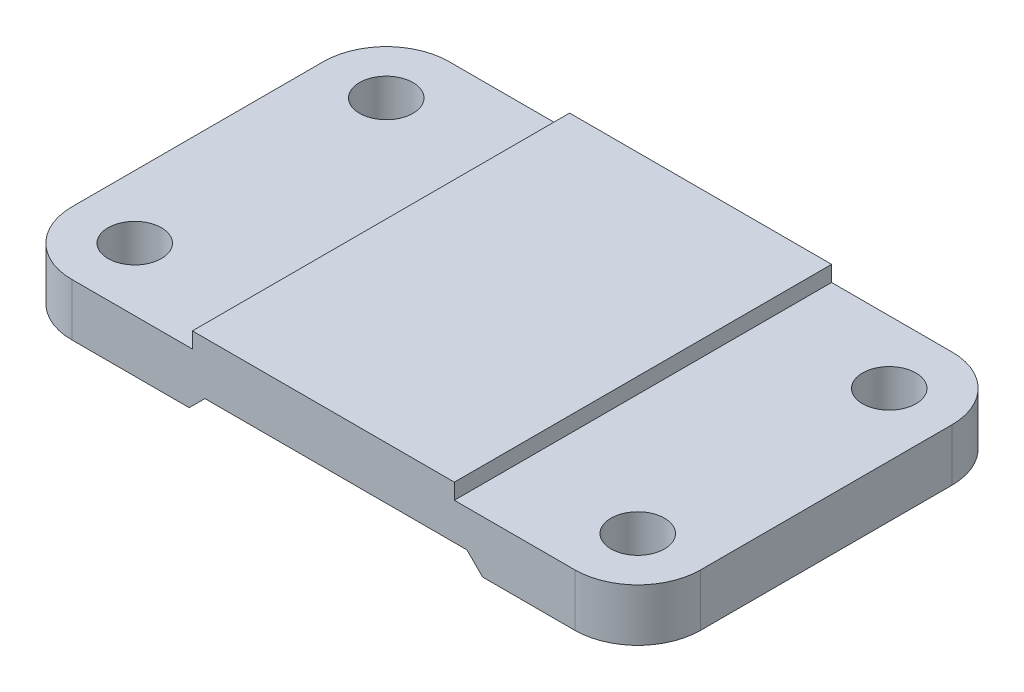
ISO-10303-21;
HEADER;
FILE_DESCRIPTION(('STEP AP214'),'2;1');
FILE_NAME('part.step','',(''),(''),'','','');
FILE_SCHEMA(('AUTOMOTIVE_DESIGN { 1 0 10303 214 1 1 1 1 }'));
ENDSEC;
DATA;
#1=APPLICATION_CONTEXT('core data for automotive mechanical design processes');
#2=APPLICATION_PROTOCOL_DEFINITION('international standard','automotive_design',2000,#1);
#3=PRODUCT_CONTEXT('',#1,'mechanical');
#4=PRODUCT('Part','Part','',(#3));
#5=PRODUCT_RELATED_PRODUCT_CATEGORY('part','',(#4));
#6=PRODUCT_DEFINITION_FORMATION('','',#4);
#7=PRODUCT_DEFINITION_CONTEXT('part definition',#1,'design');
#8=PRODUCT_DEFINITION('design','',#6,#7);
#9=PRODUCT_DEFINITION_SHAPE('','',#8);
#10=(LENGTH_UNIT() NAMED_UNIT(*) SI_UNIT(.MILLI.,.METRE.));
#11=(NAMED_UNIT(*) PLANE_ANGLE_UNIT() SI_UNIT($,.RADIAN.));
#12=(NAMED_UNIT(*) SI_UNIT($,.STERADIAN.) SOLID_ANGLE_UNIT());
#13=UNCERTAINTY_MEASURE_WITH_UNIT(LENGTH_MEASURE(1.E-05),#10,'distance_accuracy_value','');
#14=(GEOMETRIC_REPRESENTATION_CONTEXT(3) GLOBAL_UNCERTAINTY_ASSIGNED_CONTEXT((#13)) GLOBAL_UNIT_ASSIGNED_CONTEXT((#10,
#11,#12)) REPRESENTATION_CONTEXT('',''));
#15=CARTESIAN_POINT('',(0.,0.,0.));
#16=DIRECTION('',(0.,0.,1.));
#17=DIRECTION('',(1.,0.,0.));
#18=AXIS2_PLACEMENT_3D('',#15,#16,#17);
#19=CARTESIAN_POINT('',(-48.,0.,24.));
#20=DIRECTION('',(0.,-1.,0.));
#21=DIRECTION('',(0.,0.,-1.));
#22=AXIS2_PLACEMENT_3D('',#19,#20,#21);
#23=PLANE('',#22);
#24=DIRECTION('',(0.,0.,1.));
#25=VECTOR('',#24,1.);
#26=CARTESIAN_POINT('',(-25.6042673778964,0.,-36.));
#27=LINE('',#26,#25);
#28=CARTESIAN_POINT('',(-25.6042673778964,0.,-36.));
#29=VERTEX_POINT('',#28);
#30=CARTESIAN_POINT('',(-25.6042673778964,0.,36.));
#31=VERTEX_POINT('',#30);
#32=EDGE_CURVE('E287',#29,#31,#27,.T.);
#33=ORIENTED_EDGE('',*,*,#32,.T.);
#34=DIRECTION('',(1.,0.,0.));
#35=VECTOR('',#34,1.);
#36=CARTESIAN_POINT('',(47.9999999999999,0.,36.));
#37=LINE('',#36,#35);
#38=CARTESIAN_POINT('',(-47.9999999999999,0.,36.));
#39=VERTEX_POINT('',#38);
#40=EDGE_CURVE('E221',#39,#31,#37,.T.);
#41=ORIENTED_EDGE('',*,*,#40,.F.);
#42=CARTESIAN_POINT('',(-48.,0.,24.));
#43=DIRECTION('',(0.,1.,0.));
#44=DIRECTION('',(0.,0.,-1.));
#45=AXIS2_PLACEMENT_3D('',#42,#43,#44);
#46=CIRCLE('',#45,12.);
#47=CARTESIAN_POINT('',(-60.,0.,23.9999999999999));
#48=VERTEX_POINT('',#47);
#49=EDGE_CURVE('E226',#48,#39,#46,.T.);
#50=ORIENTED_EDGE('',*,*,#49,.F.);
#51=DIRECTION('',(0.,0.,1.));
#52=VECTOR('',#51,1.);
#53=CARTESIAN_POINT('',(-60.,0.,-23.9999999999999));
#54=LINE('',#53,#52);
#55=CARTESIAN_POINT('',(-60.,0.,-23.9999999999999));
#56=VERTEX_POINT('',#55);
#57=EDGE_CURVE('E185',#56,#48,#54,.T.);
#58=ORIENTED_EDGE('',*,*,#57,.F.);
#59=CARTESIAN_POINT('',(-48.,0.,-24.));
#60=DIRECTION('',(0.,1.,0.));
#61=DIRECTION('',(0.,0.,1.));
#62=AXIS2_PLACEMENT_3D('',#59,#60,#61);
#63=CIRCLE('',#62,12.);
#64=CARTESIAN_POINT('',(-47.9999999999999,0.,-36.));
#65=VERTEX_POINT('',#64);
#66=EDGE_CURVE('E182',#65,#56,#63,.T.);
#67=ORIENTED_EDGE('',*,*,#66,.F.);
#68=DIRECTION('',(-1.,0.,0.));
#69=VECTOR('',#68,1.);
#70=CARTESIAN_POINT('',(47.9999999999999,0.,-36.));
#71=LINE('',#70,#69);
#72=EDGE_CURVE('E183',#29,#65,#71,.T.);
#73=ORIENTED_EDGE('',*,*,#72,.F.);
#74=EDGE_LOOP('',(#33,#41,#50,#58,#67,#73));
#75=FACE_BOUND('',#74,.T.);
#76=CARTESIAN_POINT('',(-48.,0.,24.));
#77=DIRECTION('',(0.,1.,0.));
#78=DIRECTION('',(0.,0.,-1.));
#79=AXIS2_PLACEMENT_3D('',#76,#77,#78);
#80=CIRCLE('',#79,5.09999999999998);
#81=CARTESIAN_POINT('',(-48.,0.,18.9));
#82=VERTEX_POINT('',#81);
#83=EDGE_CURVE('E252',#82,#82,#80,.T.);
#84=ORIENTED_EDGE('',*,*,#83,.T.);
#85=EDGE_LOOP('',(#84));
#86=FACE_BOUND('',#85,.T.);
#87=CARTESIAN_POINT('',(-48.,0.,-24.));
#88=DIRECTION('',(0.,1.,0.));
#89=DIRECTION('',(0.,0.,1.));
#90=AXIS2_PLACEMENT_3D('',#87,#88,#89);
#91=CIRCLE('',#90,5.1);
#92=CARTESIAN_POINT('',(-48.,0.,-18.9));
#93=VERTEX_POINT('',#92);
#94=EDGE_CURVE('E246',#93,#93,#91,.T.);
#95=ORIENTED_EDGE('',*,*,#94,.T.);
#96=EDGE_LOOP('',(#95));
#97=FACE_BOUND('',#96,.T.);
#98=ADVANCED_FACE('F43',(#75,#86,#97),#23,.T.);
#99=CARTESIAN_POINT('',(-48.,10.,24.));
#100=DIRECTION('',(0.,-1.,0.));
#101=DIRECTION('',(0.,0.,-1.));
#102=AXIS2_PLACEMENT_3D('',#99,#100,#101);
#103=PLANE('',#102);
#104=CARTESIAN_POINT('',(-48.,10.,24.));
#105=DIRECTION('',(0.,1.,0.));
#106=DIRECTION('',(0.,0.,-1.));
#107=AXIS2_PLACEMENT_3D('',#104,#105,#106);
#108=CIRCLE('',#107,5.09999999999998);
#109=CARTESIAN_POINT('',(-48.,10.,18.9));
#110=VERTEX_POINT('',#109);
#111=EDGE_CURVE('E249',#110,#110,#108,.T.);
#112=ORIENTED_EDGE('',*,*,#111,.F.);
#113=EDGE_LOOP('',(#112));
#114=FACE_BOUND('',#113,.T.);
#115=CARTESIAN_POINT('',(-48.,10.,-24.));
#116=DIRECTION('',(0.,1.,0.));
#117=DIRECTION('',(0.,0.,1.));
#118=AXIS2_PLACEMENT_3D('',#115,#116,#117);
#119=CIRCLE('',#118,5.1);
#120=CARTESIAN_POINT('',(-48.,10.,-18.9));
#121=VERTEX_POINT('',#120);
#122=EDGE_CURVE('E229',#121,#121,#119,.T.);
#123=ORIENTED_EDGE('',*,*,#122,.F.);
#124=EDGE_LOOP('',(#123));
#125=FACE_BOUND('',#124,.T.);
#126=DIRECTION('',(0.,0.,1.));
#127=VECTOR('',#126,1.);
#128=CARTESIAN_POINT('',(-25.,10.,36.));
#129=LINE('',#128,#127);
#130=CARTESIAN_POINT('',(-25.,10.,-36.));
#131=VERTEX_POINT('',#130);
#132=CARTESIAN_POINT('',(-25.,10.,36.));
#133=VERTEX_POINT('',#132);
#134=EDGE_CURVE('E66',#131,#133,#129,.T.);
#135=ORIENTED_EDGE('',*,*,#134,.F.);
#136=DIRECTION('',(-1.,0.,0.));
#137=VECTOR('',#136,1.);
#138=CARTESIAN_POINT('',(47.9999999999999,10.,-36.));
#139=LINE('',#138,#137);
#140=CARTESIAN_POINT('',(-47.9999999999999,10.,-36.));
#141=VERTEX_POINT('',#140);
#142=EDGE_CURVE('E235',#131,#141,#139,.T.);
#143=ORIENTED_EDGE('',*,*,#142,.T.);
#144=CARTESIAN_POINT('',(-48.,10.,-24.));
#145=DIRECTION('',(0.,1.,0.));
#146=DIRECTION('',(0.,0.,1.));
#147=AXIS2_PLACEMENT_3D('',#144,#145,#146);
#148=CIRCLE('',#147,12.);
#149=CARTESIAN_POINT('',(-60.,10.,-23.9999999999999));
#150=VERTEX_POINT('',#149);
#151=EDGE_CURVE('E231',#141,#150,#148,.T.);
#152=ORIENTED_EDGE('',*,*,#151,.T.);
#153=DIRECTION('',(0.,0.,1.));
#154=VECTOR('',#153,1.);
#155=CARTESIAN_POINT('',(-60.,10.,-23.9999999999999));
#156=LINE('',#155,#154);
#157=CARTESIAN_POINT('',(-60.,10.,23.9999999999999));
#158=VERTEX_POINT('',#157);
#159=EDGE_CURVE('E197',#150,#158,#156,.T.);
#160=ORIENTED_EDGE('',*,*,#159,.T.);
#161=CARTESIAN_POINT('',(-48.,10.,24.));
#162=DIRECTION('',(0.,1.,0.));
#163=DIRECTION('',(0.,0.,-1.));
#164=AXIS2_PLACEMENT_3D('',#161,#162,#163);
#165=CIRCLE('',#164,12.);
#166=CARTESIAN_POINT('',(-47.9999999999999,10.,36.));
#167=VERTEX_POINT('',#166);
#168=EDGE_CURVE('E192',#158,#167,#165,.T.);
#169=ORIENTED_EDGE('',*,*,#168,.T.);
#170=DIRECTION('',(1.,0.,0.));
#171=VECTOR('',#170,1.);
#172=CARTESIAN_POINT('',(47.9999999999999,10.,36.));
#173=LINE('',#172,#171);
#174=EDGE_CURVE('E241',#167,#133,#173,.T.);
#175=ORIENTED_EDGE('',*,*,#174,.T.);
#176=EDGE_LOOP('',(#135,#143,#152,#160,#169,#175));
#177=FACE_BOUND('',#176,.T.);
#178=ADVANCED_FACE('F326',(#114,#125,#177),#103,.F.);
#179=CARTESIAN_POINT('',(48.,10.,-24.));
#180=DIRECTION('',(0.,1.,0.));
#181=DIRECTION('',(0.,0.,-1.));
#182=AXIS2_PLACEMENT_3D('',#179,#180,#181);
#183=CIRCLE('',#182,5.1);
#184=CARTESIAN_POINT('',(48.,10.,-29.1));
#185=VERTEX_POINT('',#184);
#186=EDGE_CURVE('E261',#185,#185,#183,.T.);
#187=ORIENTED_EDGE('',*,*,#186,.F.);
#188=EDGE_LOOP('',(#187));
#189=FACE_BOUND('',#188,.T.);
#190=CARTESIAN_POINT('',(48.,10.,24.));
#191=DIRECTION('',(0.,1.,0.));
#192=DIRECTION('',(0.,0.,1.));
#193=AXIS2_PLACEMENT_3D('',#190,#191,#192);
#194=CIRCLE('',#193,5.09999999999998);
#195=CARTESIAN_POINT('',(48.,10.,29.1));
#196=VERTEX_POINT('',#195);
#197=EDGE_CURVE('E255',#196,#196,#194,.T.);
#198=ORIENTED_EDGE('',*,*,#197,.F.);
#199=EDGE_LOOP('',(#198));
#200=FACE_BOUND('',#199,.T.);
#201=DIRECTION('',(0.,0.,-1.));
#202=VECTOR('',#201,1.);
#203=CARTESIAN_POINT('',(25.,10.,36.));
#204=LINE('',#203,#202);
#205=CARTESIAN_POINT('',(25.,10.,36.));
#206=VERTEX_POINT('',#205);
#207=CARTESIAN_POINT('',(25.,10.,-36.));
#208=VERTEX_POINT('',#207);
#209=EDGE_CURVE('E282',#206,#208,#204,.T.);
#210=ORIENTED_EDGE('',*,*,#209,.F.);
#211=CARTESIAN_POINT('',(47.9999999999999,10.,36.));
#212=VERTEX_POINT('',#211);
#213=EDGE_CURVE('E243',#206,#212,#173,.T.);
#214=ORIENTED_EDGE('',*,*,#213,.T.);
#215=CARTESIAN_POINT('',(48.,10.,24.));
#216=DIRECTION('',(0.,1.,0.));
#217=DIRECTION('',(0.,0.,-1.));
#218=AXIS2_PLACEMENT_3D('',#215,#216,#217);
#219=CIRCLE('',#218,12.);
#220=CARTESIAN_POINT('',(60.,10.,23.9999999999999));
#221=VERTEX_POINT('',#220);
#222=EDGE_CURVE('E216',#212,#221,#219,.T.);
#223=ORIENTED_EDGE('',*,*,#222,.T.);
#224=DIRECTION('',(0.,0.,-1.));
#225=VECTOR('',#224,1.);
#226=CARTESIAN_POINT('',(60.,10.,-23.9999999999999));
#227=LINE('',#226,#225);
#228=CARTESIAN_POINT('',(60.,10.,-23.9999999999999));
#229=VERTEX_POINT('',#228);
#230=EDGE_CURVE('E238',#221,#229,#227,.T.);
#231=ORIENTED_EDGE('',*,*,#230,.T.);
#232=CARTESIAN_POINT('',(48.,10.,-24.));
#233=DIRECTION('',(0.,1.,0.));
#234=DIRECTION('',(0.,0.,-1.));
#235=AXIS2_PLACEMENT_3D('',#232,#233,#234);
#236=CIRCLE('',#235,12.);
#237=CARTESIAN_POINT('',(47.9999999999999,10.,-36.));
#238=VERTEX_POINT('',#237);
#239=EDGE_CURVE('E236',#229,#238,#236,.T.);
#240=ORIENTED_EDGE('',*,*,#239,.T.);
#241=EDGE_CURVE('E233',#238,#208,#139,.T.);
#242=ORIENTED_EDGE('',*,*,#241,.T.);
#243=EDGE_LOOP('',(#210,#214,#223,#231,#240,#242));
#244=FACE_BOUND('',#243,.T.);
#245=ADVANCED_FACE('F342',(#189,#200,#244),#103,.F.);
#246=DIRECTION('',(0.,0.,1.));
#247=VECTOR('',#246,1.);
#248=CARTESIAN_POINT('',(30.3957326221036,0.,-36.));
#249=LINE('',#248,#247);
#250=CARTESIAN_POINT('',(30.3957326221036,0.,-36.));
#251=VERTEX_POINT('',#250);
#252=CARTESIAN_POINT('',(30.3957326221036,0.,36.));
#253=VERTEX_POINT('',#252);
#254=EDGE_CURVE('E159',#251,#253,#249,.T.);
#255=ORIENTED_EDGE('',*,*,#254,.F.);
#256=CARTESIAN_POINT('',(47.9999999999999,0.,-36.));
#257=VERTEX_POINT('',#256);
#258=EDGE_CURVE('E172',#257,#251,#71,.T.);
#259=ORIENTED_EDGE('',*,*,#258,.F.);
#260=CARTESIAN_POINT('',(48.,0.,-24.));
#261=DIRECTION('',(0.,1.,0.));
#262=DIRECTION('',(0.,0.,-1.));
#263=AXIS2_PLACEMENT_3D('',#260,#261,#262);
#264=CIRCLE('',#263,12.);
#265=CARTESIAN_POINT('',(60.,0.,-23.9999999999999));
#266=VERTEX_POINT('',#265);
#267=EDGE_CURVE('E187',#266,#257,#264,.T.);
#268=ORIENTED_EDGE('',*,*,#267,.F.);
#269=DIRECTION('',(0.,0.,-1.));
#270=VECTOR('',#269,1.);
#271=CARTESIAN_POINT('',(60.,0.,-23.9999999999999));
#272=LINE('',#271,#270);
#273=CARTESIAN_POINT('',(60.,0.,23.9999999999999));
#274=VERTEX_POINT('',#273);
#275=EDGE_CURVE('E220',#274,#266,#272,.T.);
#276=ORIENTED_EDGE('',*,*,#275,.F.);
#277=CARTESIAN_POINT('',(48.,0.,24.));
#278=DIRECTION('',(0.,1.,0.));
#279=DIRECTION('',(0.,0.,-1.));
#280=AXIS2_PLACEMENT_3D('',#277,#278,#279);
#281=CIRCLE('',#280,12.);
#282=CARTESIAN_POINT('',(47.9999999999999,0.,36.));
#283=VERTEX_POINT('',#282);
#284=EDGE_CURVE('E215',#283,#274,#281,.T.);
#285=ORIENTED_EDGE('',*,*,#284,.F.);
#286=EDGE_CURVE('E174',#253,#283,#37,.T.);
#287=ORIENTED_EDGE('',*,*,#286,.F.);
#288=EDGE_LOOP('',(#255,#259,#268,#276,#285,#287));
#289=FACE_BOUND('',#288,.T.);
#290=CARTESIAN_POINT('',(48.,0.,24.));
#291=DIRECTION('',(0.,1.,0.));
#292=DIRECTION('',(0.,0.,1.));
#293=AXIS2_PLACEMENT_3D('',#290,#291,#292);
#294=CIRCLE('',#293,5.09999999999998);
#295=CARTESIAN_POINT('',(48.,0.,29.1));
#296=VERTEX_POINT('',#295);
#297=EDGE_CURVE('E258',#296,#296,#294,.T.);
#298=ORIENTED_EDGE('',*,*,#297,.T.);
#299=EDGE_LOOP('',(#298));
#300=FACE_BOUND('',#299,.T.);
#301=CARTESIAN_POINT('',(48.,0.,-24.));
#302=DIRECTION('',(0.,1.,0.));
#303=DIRECTION('',(0.,0.,-1.));
#304=AXIS2_PLACEMENT_3D('',#301,#302,#303);
#305=CIRCLE('',#304,5.1);
#306=CARTESIAN_POINT('',(48.,0.,-29.1));
#307=VERTEX_POINT('',#306);
#308=EDGE_CURVE('E264',#307,#307,#305,.T.);
#309=ORIENTED_EDGE('',*,*,#308,.T.);
#310=EDGE_LOOP('',(#309));
#311=FACE_BOUND('',#310,.T.);
#312=ADVANCED_FACE('F169',(#289,#300,#311),#23,.T.);
#313=CARTESIAN_POINT('',(-48.,10.,24.));
#314=DIRECTION('',(0.,-1.,0.));
#315=DIRECTION('',(0.,0.,-1.));
#316=AXIS2_PLACEMENT_3D('',#313,#314,#315);
#317=CYLINDRICAL_SURFACE('',#316,12.);
#318=ORIENTED_EDGE('',*,*,#49,.T.);
#319=DIRECTION('',(0.,-1.,0.));
#320=VECTOR('',#319,1.);
#321=CARTESIAN_POINT('',(-47.9999999999999,10.,36.));
#322=LINE('',#321,#320);
#323=EDGE_CURVE('E11',#167,#39,#322,.T.);
#324=ORIENTED_EDGE('',*,*,#323,.F.);
#325=ORIENTED_EDGE('',*,*,#168,.F.);
#326=DIRECTION('',(0.,-1.,0.));
#327=VECTOR('',#326,1.);
#328=CARTESIAN_POINT('',(-60.,10.,23.9999999999999));
#329=LINE('',#328,#327);
#330=EDGE_CURVE('E193',#158,#48,#329,.T.);
#331=ORIENTED_EDGE('',*,*,#330,.T.);
#332=EDGE_LOOP('',(#318,#324,#325,#331));
#333=FACE_BOUND('',#332,.T.);
#334=ADVANCED_FACE('F45',(#333),#317,.T.);
#335=CARTESIAN_POINT('',(47.9999999999999,10.,36.));
#336=DIRECTION('',(0.,0.,-1.));
#337=DIRECTION('',(-1.,0.,0.));
#338=AXIS2_PLACEMENT_3D('',#335,#336,#337);
#339=PLANE('',#338);
#340=ORIENTED_EDGE('',*,*,#40,.T.);
#341=DIRECTION('',(-0.707106781186551,-0.707106781186543,0.));
#342=VECTOR('',#341,1.);
#343=CARTESIAN_POINT('',(-25.6042673778964,0.,36.));
#344=LINE('',#343,#342);
#345=CARTESIAN_POINT('',(-22.6042673778963,2.99999999999999,36.));
#346=VERTEX_POINT('',#345);
#347=EDGE_CURVE('E164',#346,#31,#344,.T.);
#348=ORIENTED_EDGE('',*,*,#347,.F.);
#349=DIRECTION('',(-1.,0.,0.));
#350=VECTOR('',#349,1.);
#351=CARTESIAN_POINT('',(-22.6042673778963,2.99999999999999,36.));
#352=LINE('',#351,#350);
#353=CARTESIAN_POINT('',(27.3957326221036,2.99999999999999,36.));
#354=VERTEX_POINT('',#353);
#355=EDGE_CURVE('E301',#354,#346,#352,.T.);
#356=ORIENTED_EDGE('',*,*,#355,.F.);
#357=DIRECTION('',(-0.707106781186551,0.707106781186544,0.));
#358=VECTOR('',#357,1.);
#359=CARTESIAN_POINT('',(27.3957326221036,2.99999999999999,36.));
#360=LINE('',#359,#358);
#361=EDGE_CURVE('E304',#253,#354,#360,.T.);
#362=ORIENTED_EDGE('',*,*,#361,.F.);
#363=ORIENTED_EDGE('',*,*,#286,.T.);
#364=DIRECTION('',(0.,-1.,0.));
#365=VECTOR('',#364,1.);
#366=CARTESIAN_POINT('',(47.9999999999999,10.,36.));
#367=LINE('',#366,#365);
#368=EDGE_CURVE('E51',#212,#283,#367,.T.);
#369=ORIENTED_EDGE('',*,*,#368,.F.);
#370=ORIENTED_EDGE('',*,*,#213,.F.);
#371=DIRECTION('',(0.,-1.,0.));
#372=VECTOR('',#371,1.);
#373=CARTESIAN_POINT('',(25.,13.,36.));
#374=LINE('',#373,#372);
#375=CARTESIAN_POINT('',(25.,13.,36.));
#376=VERTEX_POINT('',#375);
#377=EDGE_CURVE('E272',#376,#206,#374,.T.);
#378=ORIENTED_EDGE('',*,*,#377,.F.);
#379=DIRECTION('',(1.,0.,0.));
#380=VECTOR('',#379,1.);
#381=CARTESIAN_POINT('',(25.,13.,36.));
#382=LINE('',#381,#380);
#383=CARTESIAN_POINT('',(-25.,13.,36.));
#384=VERTEX_POINT('',#383);
#385=EDGE_CURVE('E291',#384,#376,#382,.T.);
#386=ORIENTED_EDGE('',*,*,#385,.F.);
#387=DIRECTION('',(0.,-1.,0.));
#388=VECTOR('',#387,1.);
#389=CARTESIAN_POINT('',(-25.,13.,36.));
#390=LINE('',#389,#388);
#391=EDGE_CURVE('E267',#384,#133,#390,.T.);
#392=ORIENTED_EDGE('',*,*,#391,.T.);
#393=ORIENTED_EDGE('',*,*,#174,.F.);
#394=ORIENTED_EDGE('',*,*,#323,.T.);
#395=EDGE_LOOP('',(#340,#348,#356,#362,#363,#369,#370,#378,#386,#392,#393,#394));
#396=FACE_BOUND('',#395,.T.);
#397=ADVANCED_FACE('F343',(#396),#339,.F.);
#398=CARTESIAN_POINT('',(48.,10.,24.));
#399=DIRECTION('',(0.,-1.,0.));
#400=DIRECTION('',(0.,0.,-1.));
#401=AXIS2_PLACEMENT_3D('',#398,#399,#400);
#402=CYLINDRICAL_SURFACE('',#401,12.);
#403=ORIENTED_EDGE('',*,*,#284,.T.);
#404=DIRECTION('',(0.,-1.,0.));
#405=VECTOR('',#404,1.);
#406=CARTESIAN_POINT('',(60.,10.,23.9999999999999));
#407=LINE('',#406,#405);
#408=EDGE_CURVE('E207',#221,#274,#407,.T.);
#409=ORIENTED_EDGE('',*,*,#408,.F.);
#410=ORIENTED_EDGE('',*,*,#222,.F.);
#411=ORIENTED_EDGE('',*,*,#368,.T.);
#412=EDGE_LOOP('',(#403,#409,#410,#411));
#413=FACE_BOUND('',#412,.T.);
#414=ADVANCED_FACE('F213',(#413),#402,.T.);
#415=CARTESIAN_POINT('',(60.,10.,-23.9999999999999));
#416=DIRECTION('',(-1.,0.,0.));
#417=DIRECTION('',(0.,0.,1.));
#418=AXIS2_PLACEMENT_3D('',#415,#416,#417);
#419=PLANE('',#418);
#420=ORIENTED_EDGE('',*,*,#275,.T.);
#421=DIRECTION('',(0.,-1.,0.));
#422=VECTOR('',#421,1.);
#423=CARTESIAN_POINT('',(60.,10.,-23.9999999999999));
#424=LINE('',#423,#422);
#425=EDGE_CURVE('E204',#229,#266,#424,.T.);
#426=ORIENTED_EDGE('',*,*,#425,.F.);
#427=ORIENTED_EDGE('',*,*,#230,.F.);
#428=ORIENTED_EDGE('',*,*,#408,.T.);
#429=EDGE_LOOP('',(#420,#426,#427,#428));
#430=FACE_BOUND('',#429,.T.);
#431=ADVANCED_FACE('F370',(#430),#419,.F.);
#432=CARTESIAN_POINT('',(48.,10.,-24.));
#433=DIRECTION('',(0.,-1.,0.));
#434=DIRECTION('',(0.,0.,-1.));
#435=AXIS2_PLACEMENT_3D('',#432,#433,#434);
#436=CYLINDRICAL_SURFACE('',#435,12.);
#437=ORIENTED_EDGE('',*,*,#267,.T.);
#438=DIRECTION('',(0.,-1.,0.));
#439=VECTOR('',#438,1.);
#440=CARTESIAN_POINT('',(47.9999999999999,10.,-36.));
#441=LINE('',#440,#439);
#442=EDGE_CURVE('E181',#238,#257,#441,.T.);
#443=ORIENTED_EDGE('',*,*,#442,.F.);
#444=ORIENTED_EDGE('',*,*,#239,.F.);
#445=ORIENTED_EDGE('',*,*,#425,.T.);
#446=EDGE_LOOP('',(#437,#443,#444,#445));
#447=FACE_BOUND('',#446,.T.);
#448=ADVANCED_FACE('F367',(#447),#436,.T.);
#449=CARTESIAN_POINT('',(47.9999999999999,10.,-36.));
#450=DIRECTION('',(0.,0.,1.));
#451=DIRECTION('',(1.,0.,0.));
#452=AXIS2_PLACEMENT_3D('',#449,#450,#451);
#453=PLANE('',#452);
#454=DIRECTION('',(-1.,0.,0.));
#455=VECTOR('',#454,1.);
#456=CARTESIAN_POINT('',(-22.6042673778963,2.99999999999999,-36.));
#457=LINE('',#456,#455);
#458=CARTESIAN_POINT('',(27.3957326221036,2.99999999999999,-36.));
#459=VERTEX_POINT('',#458);
#460=CARTESIAN_POINT('',(-22.6042673778963,2.99999999999999,-36.));
#461=VERTEX_POINT('',#460);
#462=EDGE_CURVE('E58',#459,#461,#457,.T.);
#463=ORIENTED_EDGE('',*,*,#462,.T.);
#464=DIRECTION('',(-0.707106781186551,-0.707106781186543,0.));
#465=VECTOR('',#464,1.);
#466=CARTESIAN_POINT('',(-25.6042673778964,0.,-36.));
#467=LINE('',#466,#465);
#468=EDGE_CURVE('E175',#461,#29,#467,.T.);
#469=ORIENTED_EDGE('',*,*,#468,.T.);
#470=ORIENTED_EDGE('',*,*,#72,.T.);
#471=DIRECTION('',(0.,-1.,0.));
#472=VECTOR('',#471,1.);
#473=CARTESIAN_POINT('',(-47.9999999999999,10.,-36.));
#474=LINE('',#473,#472);
#475=EDGE_CURVE('E200',#141,#65,#474,.T.);
#476=ORIENTED_EDGE('',*,*,#475,.F.);
#477=ORIENTED_EDGE('',*,*,#142,.F.);
#478=DIRECTION('',(0.,-1.,0.));
#479=VECTOR('',#478,1.);
#480=CARTESIAN_POINT('',(-25.,13.,-36.));
#481=LINE('',#480,#479);
#482=CARTESIAN_POINT('',(-25.,13.,-36.));
#483=VERTEX_POINT('',#482);
#484=EDGE_CURVE('E278',#483,#131,#481,.T.);
#485=ORIENTED_EDGE('',*,*,#484,.F.);
#486=DIRECTION('',(-1.,0.,0.));
#487=VECTOR('',#486,1.);
#488=CARTESIAN_POINT('',(25.,13.,-36.));
#489=LINE('',#488,#487);
#490=CARTESIAN_POINT('',(25.,13.,-36.));
#491=VERTEX_POINT('',#490);
#492=EDGE_CURVE('E281',#491,#483,#489,.T.);
#493=ORIENTED_EDGE('',*,*,#492,.F.);
#494=DIRECTION('',(0.,-1.,0.));
#495=VECTOR('',#494,1.);
#496=CARTESIAN_POINT('',(25.,13.,-36.));
#497=LINE('',#496,#495);
#498=EDGE_CURVE('E275',#491,#208,#497,.T.);
#499=ORIENTED_EDGE('',*,*,#498,.T.);
#500=ORIENTED_EDGE('',*,*,#241,.F.);
#501=ORIENTED_EDGE('',*,*,#442,.T.);
#502=ORIENTED_EDGE('',*,*,#258,.T.);
#503=DIRECTION('',(-0.707106781186551,0.707106781186544,0.));
#504=VECTOR('',#503,1.);
#505=CARTESIAN_POINT('',(27.3957326221036,2.99999999999999,-36.));
#506=LINE('',#505,#504);
#507=EDGE_CURVE('E155',#251,#459,#506,.T.);
#508=ORIENTED_EDGE('',*,*,#507,.T.);
#509=EDGE_LOOP('',(#463,#469,#470,#476,#477,#485,#493,#499,#500,#501,#502,#508));
#510=FACE_BOUND('',#509,.T.);
#511=ADVANCED_FACE('F178',(#510),#453,.F.);
#512=CARTESIAN_POINT('',(-48.,10.,-24.));
#513=DIRECTION('',(0.,-1.,0.));
#514=DIRECTION('',(0.,0.,-1.));
#515=AXIS2_PLACEMENT_3D('',#512,#513,#514);
#516=CYLINDRICAL_SURFACE('',#515,12.);
#517=ORIENTED_EDGE('',*,*,#66,.T.);
#518=DIRECTION('',(0.,-1.,0.));
#519=VECTOR('',#518,1.);
#520=CARTESIAN_POINT('',(-60.,10.,-23.9999999999999));
#521=LINE('',#520,#519);
#522=EDGE_CURVE('E196',#150,#56,#521,.T.);
#523=ORIENTED_EDGE('',*,*,#522,.F.);
#524=ORIENTED_EDGE('',*,*,#151,.F.);
#525=ORIENTED_EDGE('',*,*,#475,.T.);
#526=EDGE_LOOP('',(#517,#523,#524,#525));
#527=FACE_BOUND('',#526,.T.);
#528=ADVANCED_FACE('F319',(#527),#516,.T.);
#529=CARTESIAN_POINT('',(-60.,10.,-23.9999999999999));
#530=DIRECTION('',(1.,0.,0.));
#531=DIRECTION('',(0.,0.,-1.));
#532=AXIS2_PLACEMENT_3D('',#529,#530,#531);
#533=PLANE('',#532);
#534=ORIENTED_EDGE('',*,*,#57,.T.);
#535=ORIENTED_EDGE('',*,*,#330,.F.);
#536=ORIENTED_EDGE('',*,*,#159,.F.);
#537=ORIENTED_EDGE('',*,*,#522,.T.);
#538=EDGE_LOOP('',(#534,#535,#536,#537));
#539=FACE_BOUND('',#538,.T.);
#540=ADVANCED_FACE('F323',(#539),#533,.F.);
#541=CARTESIAN_POINT('',(-48.,10.,-24.));
#542=DIRECTION('',(0.,-1.,0.));
#543=DIRECTION('',(0.,0.,-1.));
#544=AXIS2_PLACEMENT_3D('',#541,#542,#543);
#545=CYLINDRICAL_SURFACE('',#544,5.1);
#546=ORIENTED_EDGE('',*,*,#122,.T.);
#547=EDGE_LOOP('',(#546));
#548=FACE_BOUND('',#547,.T.);
#549=ORIENTED_EDGE('',*,*,#94,.F.);
#550=EDGE_LOOP('',(#549));
#551=FACE_BOUND('',#550,.T.);
#552=ADVANCED_FACE('F362',(#548,#551),#545,.F.);
#553=CARTESIAN_POINT('',(-48.,10.,24.));
#554=DIRECTION('',(0.,-1.,0.));
#555=DIRECTION('',(0.,0.,-1.));
#556=AXIS2_PLACEMENT_3D('',#553,#554,#555);
#557=CYLINDRICAL_SURFACE('',#556,5.09999999999998);
#558=ORIENTED_EDGE('',*,*,#111,.T.);
#559=EDGE_LOOP('',(#558));
#560=FACE_BOUND('',#559,.T.);
#561=ORIENTED_EDGE('',*,*,#83,.F.);
#562=EDGE_LOOP('',(#561));
#563=FACE_BOUND('',#562,.T.);
#564=ADVANCED_FACE('F408',(#560,#563),#557,.F.);
#565=CARTESIAN_POINT('',(48.,10.,24.));
#566=DIRECTION('',(0.,-1.,0.));
#567=DIRECTION('',(0.,0.,-1.));
#568=AXIS2_PLACEMENT_3D('',#565,#566,#567);
#569=CYLINDRICAL_SURFACE('',#568,5.09999999999998);
#570=ORIENTED_EDGE('',*,*,#197,.T.);
#571=EDGE_LOOP('',(#570));
#572=FACE_BOUND('',#571,.T.);
#573=ORIENTED_EDGE('',*,*,#297,.F.);
#574=EDGE_LOOP('',(#573));
#575=FACE_BOUND('',#574,.T.);
#576=ADVANCED_FACE('F416',(#572,#575),#569,.F.);
#577=CARTESIAN_POINT('',(48.,10.,-24.));
#578=DIRECTION('',(0.,-1.,0.));
#579=DIRECTION('',(0.,0.,-1.));
#580=AXIS2_PLACEMENT_3D('',#577,#578,#579);
#581=CYLINDRICAL_SURFACE('',#580,5.1);
#582=ORIENTED_EDGE('',*,*,#186,.T.);
#583=EDGE_LOOP('',(#582));
#584=FACE_BOUND('',#583,.T.);
#585=ORIENTED_EDGE('',*,*,#308,.F.);
#586=EDGE_LOOP('',(#585));
#587=FACE_BOUND('',#586,.T.);
#588=ADVANCED_FACE('F424',(#584,#587),#581,.F.);
#589=CARTESIAN_POINT('',(-25.,13.,36.));
#590=DIRECTION('',(1.,0.,0.));
#591=DIRECTION('',(0.,0.,-1.));
#592=AXIS2_PLACEMENT_3D('',#589,#590,#591);
#593=PLANE('',#592);
#594=ORIENTED_EDGE('',*,*,#134,.T.);
#595=ORIENTED_EDGE('',*,*,#391,.F.);
#596=DIRECTION('',(0.,0.,1.));
#597=VECTOR('',#596,1.);
#598=CARTESIAN_POINT('',(-25.,13.,36.));
#599=LINE('',#598,#597);
#600=EDGE_CURVE('E285',#483,#384,#599,.T.);
#601=ORIENTED_EDGE('',*,*,#600,.F.);
#602=ORIENTED_EDGE('',*,*,#484,.T.);
#603=EDGE_LOOP('',(#594,#595,#601,#602));
#604=FACE_BOUND('',#603,.T.);
#605=ADVANCED_FACE('F332',(#604),#593,.F.);
#606=CARTESIAN_POINT('',(25.,13.,36.));
#607=DIRECTION('',(-1.,0.,0.));
#608=DIRECTION('',(0.,0.,1.));
#609=AXIS2_PLACEMENT_3D('',#606,#607,#608);
#610=PLANE('',#609);
#611=ORIENTED_EDGE('',*,*,#209,.T.);
#612=ORIENTED_EDGE('',*,*,#498,.F.);
#613=DIRECTION('',(0.,0.,-1.));
#614=VECTOR('',#613,1.);
#615=CARTESIAN_POINT('',(25.,13.,36.));
#616=LINE('',#615,#614);
#617=EDGE_CURVE('E289',#376,#491,#616,.T.);
#618=ORIENTED_EDGE('',*,*,#617,.F.);
#619=ORIENTED_EDGE('',*,*,#377,.T.);
#620=EDGE_LOOP('',(#611,#612,#618,#619));
#621=FACE_BOUND('',#620,.T.);
#622=ADVANCED_FACE('F340',(#621),#610,.F.);
#623=CARTESIAN_POINT('',(0.,13.,0.));
#624=DIRECTION('',(0.,1.,0.));
#625=DIRECTION('',(0.,0.,1.));
#626=AXIS2_PLACEMENT_3D('',#623,#624,#625);
#627=PLANE('',#626);
#628=ORIENTED_EDGE('',*,*,#600,.T.);
#629=ORIENTED_EDGE('',*,*,#385,.T.);
#630=ORIENTED_EDGE('',*,*,#617,.T.);
#631=ORIENTED_EDGE('',*,*,#492,.T.);
#632=EDGE_LOOP('',(#628,#629,#630,#631));
#633=FACE_BOUND('',#632,.T.);
#634=ADVANCED_FACE('F335',(#633),#627,.T.);
#635=CARTESIAN_POINT('',(-25.6042673778964,0.,-36.));
#636=DIRECTION('',(-0.707106781186543,0.707106781186551,0.));
#637=DIRECTION('',(-0.707106781186552,-0.707106781186544,0.));
#638=AXIS2_PLACEMENT_3D('',#635,#636,#637);
#639=PLANE('',#638);
#640=ORIENTED_EDGE('',*,*,#347,.T.);
#641=ORIENTED_EDGE('',*,*,#32,.F.);
#642=ORIENTED_EDGE('',*,*,#468,.F.);
#643=DIRECTION('',(0.,0.,1.));
#644=VECTOR('',#643,1.);
#645=CARTESIAN_POINT('',(-22.6042673778963,2.99999999999999,-36.));
#646=LINE('',#645,#644);
#647=EDGE_CURVE('E296',#461,#346,#646,.T.);
#648=ORIENTED_EDGE('',*,*,#647,.T.);
#649=EDGE_LOOP('',(#640,#641,#642,#648));
#650=FACE_BOUND('',#649,.T.);
#651=ADVANCED_FACE('F451',(#650),#639,.F.);
#652=CARTESIAN_POINT('',(-22.6042673778963,2.99999999999999,-36.));
#653=DIRECTION('',(0.,1.,0.));
#654=DIRECTION('',(-1.,0.,0.));
#655=AXIS2_PLACEMENT_3D('',#652,#653,#654);
#656=PLANE('',#655);
#657=ORIENTED_EDGE('',*,*,#355,.T.);
#658=ORIENTED_EDGE('',*,*,#647,.F.);
#659=ORIENTED_EDGE('',*,*,#462,.F.);
#660=DIRECTION('',(0.,0.,1.));
#661=VECTOR('',#660,1.);
#662=CARTESIAN_POINT('',(27.3957326221036,2.99999999999999,-36.));
#663=LINE('',#662,#661);
#664=EDGE_CURVE('E161',#459,#354,#663,.T.);
#665=ORIENTED_EDGE('',*,*,#664,.T.);
#666=EDGE_LOOP('',(#657,#658,#659,#665));
#667=FACE_BOUND('',#666,.T.);
#668=ADVANCED_FACE('F457',(#667),#656,.F.);
#669=CARTESIAN_POINT('',(27.3957326221036,2.99999999999999,-36.));
#670=DIRECTION('',(0.707106781186544,0.707106781186551,0.));
#671=DIRECTION('',(-0.707106781186551,0.707106781186544,0.));
#672=AXIS2_PLACEMENT_3D('',#669,#670,#671);
#673=PLANE('',#672);
#674=ORIENTED_EDGE('',*,*,#361,.T.);
#675=ORIENTED_EDGE('',*,*,#664,.F.);
#676=ORIENTED_EDGE('',*,*,#507,.F.);
#677=ORIENTED_EDGE('',*,*,#254,.T.);
#678=EDGE_LOOP('',(#674,#675,#676,#677));
#679=FACE_BOUND('',#678,.T.);
#680=ADVANCED_FACE('F158',(#679),#673,.F.);
#681=CLOSED_SHELL('',(#98,#178,#245,#312,#334,#397,#414,#431,#448,#511,#528,#540,#552,#564,#576,
#588,#605,#622,#634,#651,#668,#680));
#682=MANIFOLD_SOLID_BREP('B2',#681);
#683=ADVANCED_BREP_SHAPE_REPRESENTATION('',(#18,#682),#14);
#684=SHAPE_DEFINITION_REPRESENTATION(#9,#683);
ENDSEC;
END-ISO-10303-21;
